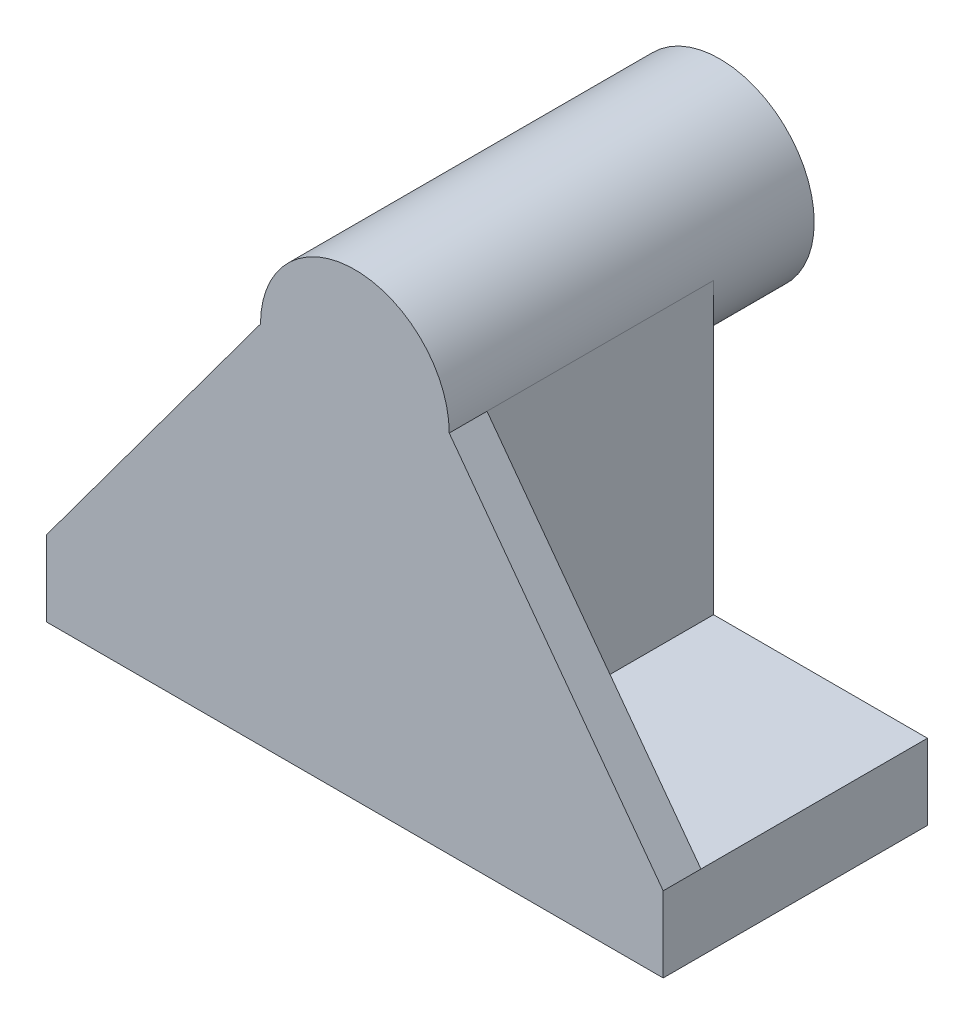
ISO-10303-21;
HEADER;
FILE_DESCRIPTION(('STEP AP214'),'2;1');
FILE_NAME('part.step','',(''),(''),'','','');
FILE_SCHEMA(('AUTOMOTIVE_DESIGN { 1 0 10303 214 1 1 1 1 }'));
ENDSEC;
DATA;
#1=APPLICATION_CONTEXT('core data for automotive mechanical design processes');
#2=APPLICATION_PROTOCOL_DEFINITION('international standard','automotive_design',2000,#1);
#3=PRODUCT_CONTEXT('',#1,'mechanical');
#4=PRODUCT('Part','Part','',(#3));
#5=PRODUCT_RELATED_PRODUCT_CATEGORY('part','',(#4));
#6=PRODUCT_DEFINITION_FORMATION('','',#4);
#7=PRODUCT_DEFINITION_CONTEXT('part definition',#1,'design');
#8=PRODUCT_DEFINITION('design','',#6,#7);
#9=PRODUCT_DEFINITION_SHAPE('','',#8);
#10=(LENGTH_UNIT() NAMED_UNIT(*) SI_UNIT(.MILLI.,.METRE.));
#11=(NAMED_UNIT(*) PLANE_ANGLE_UNIT() SI_UNIT($,.RADIAN.));
#12=(NAMED_UNIT(*) SI_UNIT($,.STERADIAN.) SOLID_ANGLE_UNIT());
#13=UNCERTAINTY_MEASURE_WITH_UNIT(LENGTH_MEASURE(1.E-05),#10,'distance_accuracy_value','');
#14=(GEOMETRIC_REPRESENTATION_CONTEXT(3) GLOBAL_UNCERTAINTY_ASSIGNED_CONTEXT((#13)) GLOBAL_UNIT_ASSIGNED_CONTEXT((#10,
#11,#12)) REPRESENTATION_CONTEXT('',''));
#15=CARTESIAN_POINT('',(0.,0.,0.));
#16=DIRECTION('',(0.,0.,1.));
#17=DIRECTION('',(1.,0.,0.));
#18=AXIS2_PLACEMENT_3D('',#15,#16,#17);
#19=CARTESIAN_POINT('',(-7.5,0.,-10.5));
#20=DIRECTION('',(-1.,0.,0.));
#21=DIRECTION('',(0.,-1.,0.));
#22=AXIS2_PLACEMENT_3D('',#19,#20,#21);
#23=PLANE('',#22);
#24=DIRECTION('',(0.,0.,1.));
#25=VECTOR('',#24,1.);
#26=CARTESIAN_POINT('',(-7.5,-23.,-10.5));
#27=LINE('',#26,#25);
#28=CARTESIAN_POINT('',(-7.5,-23.,-10.5));
#29=VERTEX_POINT('',#28);
#30=CARTESIAN_POINT('',(-7.5,-23.,7.49999999999999));
#31=VERTEX_POINT('',#30);
#32=EDGE_CURVE('E128',#29,#31,#27,.T.);
#33=ORIENTED_EDGE('',*,*,#32,.T.);
#34=DIRECTION('',(0.,1.,0.));
#35=VECTOR('',#34,1.);
#36=CARTESIAN_POINT('',(-7.5,0.,7.5));
#37=LINE('',#36,#35);
#38=CARTESIAN_POINT('',(-7.5,0.,7.49999999999999));
#39=VERTEX_POINT('',#38);
#40=EDGE_CURVE('E50',#31,#39,#37,.T.);
#41=ORIENTED_EDGE('',*,*,#40,.T.);
#42=DIRECTION('',(0.,0.,1.));
#43=VECTOR('',#42,1.);
#44=CARTESIAN_POINT('',(-7.5,0.,-10.5));
#45=LINE('',#44,#43);
#46=CARTESIAN_POINT('',(-7.5,0.,-10.5));
#47=VERTEX_POINT('',#46);
#48=EDGE_CURVE('E193',#47,#39,#45,.T.);
#49=ORIENTED_EDGE('',*,*,#48,.F.);
#50=DIRECTION('',(0.,-1.,0.));
#51=VECTOR('',#50,1.);
#52=CARTESIAN_POINT('',(-7.5,0.,-10.5));
#53=LINE('',#52,#51);
#54=EDGE_CURVE('E179',#47,#29,#53,.T.);
#55=ORIENTED_EDGE('',*,*,#54,.T.);
#56=EDGE_LOOP('',(#33,#41,#49,#55));
#57=FACE_BOUND('',#56,.T.);
#58=ADVANCED_FACE('F35',(#57),#23,.T.);
#59=CARTESIAN_POINT('',(-24.5,-23.,-10.5));
#60=DIRECTION('',(0.,-1.,0.));
#61=DIRECTION('',(0.,0.,-1.));
#62=AXIS2_PLACEMENT_3D('',#59,#60,#61);
#63=PLANE('',#62);
#64=DIRECTION('',(-1.,0.,0.));
#65=VECTOR('',#64,1.);
#66=CARTESIAN_POINT('',(-24.5,-23.,7.5));
#67=LINE('',#66,#65);
#68=CARTESIAN_POINT('',(-24.5,-23.,7.5));
#69=VERTEX_POINT('',#68);
#70=EDGE_CURVE('E11',#31,#69,#67,.T.);
#71=ORIENTED_EDGE('',*,*,#70,.F.);
#72=ORIENTED_EDGE('',*,*,#32,.F.);
#73=DIRECTION('',(1.,0.,0.));
#74=VECTOR('',#73,1.);
#75=CARTESIAN_POINT('',(-24.5,-23.,-10.5));
#76=LINE('',#75,#74);
#77=CARTESIAN_POINT('',(-24.5,-23.,-10.5));
#78=VERTEX_POINT('',#77);
#79=EDGE_CURVE('E114',#78,#29,#76,.T.);
#80=ORIENTED_EDGE('',*,*,#79,.F.);
#81=DIRECTION('',(0.,0.,1.));
#82=VECTOR('',#81,1.);
#83=CARTESIAN_POINT('',(-24.5,-23.,-10.5));
#84=LINE('',#83,#82);
#85=EDGE_CURVE('E111',#78,#69,#84,.T.);
#86=ORIENTED_EDGE('',*,*,#85,.T.);
#87=EDGE_LOOP('',(#71,#72,#80,#86));
#88=FACE_BOUND('',#87,.T.);
#89=ADVANCED_FACE('F113',(#88),#63,.F.);
#90=CARTESIAN_POINT('',(7.5,-23.,-10.5));
#91=DIRECTION('',(1.,0.,0.));
#92=DIRECTION('',(0.,0.,-1.));
#93=AXIS2_PLACEMENT_3D('',#90,#91,#92);
#94=PLANE('',#93);
#95=DIRECTION('',(0.,0.,1.));
#96=VECTOR('',#95,1.);
#97=CARTESIAN_POINT('',(7.5,0.,-10.5));
#98=LINE('',#97,#96);
#99=CARTESIAN_POINT('',(7.5,0.,-10.5));
#100=VERTEX_POINT('',#99);
#101=CARTESIAN_POINT('',(7.5,0.,7.5));
#102=VERTEX_POINT('',#101);
#103=EDGE_CURVE('E154',#100,#102,#98,.T.);
#104=ORIENTED_EDGE('',*,*,#103,.T.);
#105=DIRECTION('',(0.,-1.,0.));
#106=VECTOR('',#105,1.);
#107=CARTESIAN_POINT('',(7.5,-23.,7.5));
#108=LINE('',#107,#106);
#109=CARTESIAN_POINT('',(7.5,-23.,7.5));
#110=VERTEX_POINT('',#109);
#111=EDGE_CURVE('E168',#102,#110,#108,.T.);
#112=ORIENTED_EDGE('',*,*,#111,.T.);
#113=DIRECTION('',(0.,0.,1.));
#114=VECTOR('',#113,1.);
#115=CARTESIAN_POINT('',(7.5,-23.,-10.5));
#116=LINE('',#115,#114);
#117=CARTESIAN_POINT('',(7.5,-23.,-10.5));
#118=VERTEX_POINT('',#117);
#119=EDGE_CURVE('E196',#118,#110,#116,.T.);
#120=ORIENTED_EDGE('',*,*,#119,.F.);
#121=DIRECTION('',(0.,1.,0.));
#122=VECTOR('',#121,1.);
#123=CARTESIAN_POINT('',(7.5,-23.,-10.5));
#124=LINE('',#123,#122);
#125=EDGE_CURVE('E190',#118,#100,#124,.T.);
#126=ORIENTED_EDGE('',*,*,#125,.T.);
#127=EDGE_LOOP('',(#104,#112,#120,#126));
#128=FACE_BOUND('',#127,.T.);
#129=ADVANCED_FACE('F224',(#128),#94,.T.);
#130=CARTESIAN_POINT('',(24.5,-23.,-10.5));
#131=DIRECTION('',(0.,1.,0.));
#132=DIRECTION('',(0.,0.,1.));
#133=AXIS2_PLACEMENT_3D('',#130,#131,#132);
#134=PLANE('',#133);
#135=ORIENTED_EDGE('',*,*,#119,.T.);
#136=DIRECTION('',(1.,0.,0.));
#137=VECTOR('',#136,1.);
#138=CARTESIAN_POINT('',(24.5,-23.,7.5));
#139=LINE('',#138,#137);
#140=CARTESIAN_POINT('',(24.5,-23.,7.5));
#141=VERTEX_POINT('',#140);
#142=EDGE_CURVE('E165',#110,#141,#139,.T.);
#143=ORIENTED_EDGE('',*,*,#142,.T.);
#144=DIRECTION('',(0.,0.,1.));
#145=VECTOR('',#144,1.);
#146=CARTESIAN_POINT('',(24.5,-23.,-10.5));
#147=LINE('',#146,#145);
#148=CARTESIAN_POINT('',(24.5,-23.,-10.5));
#149=VERTEX_POINT('',#148);
#150=EDGE_CURVE('E199',#149,#141,#147,.T.);
#151=ORIENTED_EDGE('',*,*,#150,.F.);
#152=DIRECTION('',(-1.,0.,0.));
#153=VECTOR('',#152,1.);
#154=CARTESIAN_POINT('',(24.5,-23.,-10.5));
#155=LINE('',#154,#153);
#156=EDGE_CURVE('E187',#149,#118,#155,.T.);
#157=ORIENTED_EDGE('',*,*,#156,.T.);
#158=EDGE_LOOP('',(#135,#143,#151,#157));
#159=FACE_BOUND('',#158,.T.);
#160=ADVANCED_FACE('F232',(#159),#134,.T.);
#161=CARTESIAN_POINT('',(0.,0.,-10.5));
#162=DIRECTION('',(0.,0.,1.));
#163=DIRECTION('',(1.,0.,0.));
#164=AXIS2_PLACEMENT_3D('',#161,#162,#163);
#165=CYLINDRICAL_SURFACE('',#164,7.5);
#166=DIRECTION('',(0.,0.,1.));
#167=VECTOR('',#166,1.);
#168=CARTESIAN_POINT('',(-7.5,0.,-10.5));
#169=LINE('',#168,#167);
#170=CARTESIAN_POINT('',(-7.5,0.,10.5));
#171=VERTEX_POINT('',#170);
#172=EDGE_CURVE('E136',#171,#39,#169,.F.);
#173=ORIENTED_EDGE('',*,*,#172,.F.);
#174=CARTESIAN_POINT('',(0.,0.,10.5));
#175=DIRECTION('',(0.,0.,1.));
#176=DIRECTION('',(1.,0.,0.));
#177=AXIS2_PLACEMENT_3D('',#174,#175,#176);
#178=CIRCLE('',#177,7.5);
#179=CARTESIAN_POINT('',(7.5,0.,10.5));
#180=VERTEX_POINT('',#179);
#181=EDGE_CURVE('E171',#180,#171,#178,.T.);
#182=ORIENTED_EDGE('',*,*,#181,.F.);
#183=DIRECTION('',(0.,0.,-1.));
#184=VECTOR('',#183,1.);
#185=CARTESIAN_POINT('',(7.5,0.,-10.5));
#186=LINE('',#185,#184);
#187=EDGE_CURVE('E162',#102,#180,#186,.F.);
#188=ORIENTED_EDGE('',*,*,#187,.F.);
#189=ORIENTED_EDGE('',*,*,#103,.F.);
#190=CARTESIAN_POINT('',(0.,0.,-10.5));
#191=DIRECTION('',(0.,0.,1.));
#192=DIRECTION('',(1.,0.,0.));
#193=AXIS2_PLACEMENT_3D('',#190,#191,#192);
#194=CIRCLE('',#193,7.5);
#195=EDGE_CURVE('E43',#47,#100,#194,.T.);
#196=ORIENTED_EDGE('',*,*,#195,.F.);
#197=ORIENTED_EDGE('',*,*,#48,.T.);
#198=EDGE_LOOP('',(#173,#182,#188,#189,#196,#197));
#199=FACE_BOUND('',#198,.T.);
#200=CARTESIAN_POINT('',(0.,0.,-18.5));
#201=DIRECTION('',(0.,0.,1.));
#202=DIRECTION('',(1.,0.,0.));
#203=AXIS2_PLACEMENT_3D('',#200,#201,#202);
#204=CIRCLE('',#203,7.5);
#205=CARTESIAN_POINT('',(7.5,0.,-18.5));
#206=VERTEX_POINT('',#205);
#207=EDGE_CURVE('E147',#206,#206,#204,.T.);
#208=ORIENTED_EDGE('',*,*,#207,.T.);
#209=EDGE_LOOP('',(#208));
#210=FACE_BOUND('',#209,.T.);
#211=ADVANCED_FACE('F37',(#199,#210),#165,.T.);
#212=CARTESIAN_POINT('',(24.5,-29.,-10.5));
#213=DIRECTION('',(1.,0.,0.));
#214=DIRECTION('',(0.,0.,-1.));
#215=AXIS2_PLACEMENT_3D('',#212,#213,#214);
#216=PLANE('',#215);
#217=DIRECTION('',(0.,1.,0.));
#218=VECTOR('',#217,1.);
#219=CARTESIAN_POINT('',(24.5,-29.,10.5));
#220=LINE('',#219,#218);
#221=CARTESIAN_POINT('',(24.5,-29.,10.5));
#222=VERTEX_POINT('',#221);
#223=CARTESIAN_POINT('',(24.5,-23.,10.5));
#224=VERTEX_POINT('',#223);
#225=EDGE_CURVE('E176',#222,#224,#220,.T.);
#226=ORIENTED_EDGE('',*,*,#225,.F.);
#227=DIRECTION('',(0.,0.,1.));
#228=VECTOR('',#227,1.);
#229=CARTESIAN_POINT('',(24.5,-29.,-10.5));
#230=LINE('',#229,#228);
#231=CARTESIAN_POINT('',(24.5,-29.,-10.5));
#232=VERTEX_POINT('',#231);
#233=EDGE_CURVE('E202',#232,#222,#230,.T.);
#234=ORIENTED_EDGE('',*,*,#233,.F.);
#235=DIRECTION('',(0.,1.,0.));
#236=VECTOR('',#235,1.);
#237=CARTESIAN_POINT('',(24.5,-29.,-10.5));
#238=LINE('',#237,#236);
#239=EDGE_CURVE('E184',#232,#149,#238,.T.);
#240=ORIENTED_EDGE('',*,*,#239,.T.);
#241=ORIENTED_EDGE('',*,*,#150,.T.);
#242=DIRECTION('',(0.,0.,-1.));
#243=VECTOR('',#242,1.);
#244=CARTESIAN_POINT('',(24.5,-23.,-10.5));
#245=LINE('',#244,#243);
#246=EDGE_CURVE('E157',#141,#224,#245,.F.);
#247=ORIENTED_EDGE('',*,*,#246,.T.);
#248=EDGE_LOOP('',(#226,#234,#240,#241,#247));
#249=FACE_BOUND('',#248,.T.);
#250=ADVANCED_FACE('F228',(#249),#216,.T.);
#251=CARTESIAN_POINT('',(-7.5,-29.,-10.5));
#252=DIRECTION('',(0.,-1.,0.));
#253=DIRECTION('',(0.,0.,-1.));
#254=AXIS2_PLACEMENT_3D('',#251,#252,#253);
#255=PLANE('',#254);
#256=DIRECTION('',(1.,0.,0.));
#257=VECTOR('',#256,1.);
#258=CARTESIAN_POINT('',(-7.5,-29.,10.5));
#259=LINE('',#258,#257);
#260=CARTESIAN_POINT('',(-24.5,-29.,10.5));
#261=VERTEX_POINT('',#260);
#262=EDGE_CURVE('E173',#261,#222,#259,.T.);
#263=ORIENTED_EDGE('',*,*,#262,.F.);
#264=DIRECTION('',(0.,0.,1.));
#265=VECTOR('',#264,1.);
#266=CARTESIAN_POINT('',(-24.5,-29.,-10.5));
#267=LINE('',#266,#265);
#268=CARTESIAN_POINT('',(-24.5,-29.,-10.5));
#269=VERTEX_POINT('',#268);
#270=EDGE_CURVE('E117',#269,#261,#267,.T.);
#271=ORIENTED_EDGE('',*,*,#270,.F.);
#272=DIRECTION('',(1.,0.,0.));
#273=VECTOR('',#272,1.);
#274=CARTESIAN_POINT('',(-7.5,-29.,-10.5));
#275=LINE('',#274,#273);
#276=EDGE_CURVE('E182',#269,#232,#275,.T.);
#277=ORIENTED_EDGE('',*,*,#276,.T.);
#278=ORIENTED_EDGE('',*,*,#233,.T.);
#279=EDGE_LOOP('',(#263,#271,#277,#278));
#280=FACE_BOUND('',#279,.T.);
#281=ADVANCED_FACE('F215',(#280),#255,.T.);
#282=CARTESIAN_POINT('',(0.,0.,-10.5));
#283=DIRECTION('',(0.,0.,1.));
#284=DIRECTION('',(1.,0.,0.));
#285=AXIS2_PLACEMENT_3D('',#282,#283,#284);
#286=PLANE('',#285);
#287=ORIENTED_EDGE('',*,*,#125,.F.);
#288=ORIENTED_EDGE('',*,*,#156,.F.);
#289=ORIENTED_EDGE('',*,*,#239,.F.);
#290=ORIENTED_EDGE('',*,*,#276,.F.);
#291=DIRECTION('',(0.,1.,0.));
#292=VECTOR('',#291,1.);
#293=CARTESIAN_POINT('',(-24.5,-29.,-10.5));
#294=LINE('',#293,#292);
#295=EDGE_CURVE('E145',#269,#78,#294,.T.);
#296=ORIENTED_EDGE('',*,*,#295,.T.);
#297=ORIENTED_EDGE('',*,*,#79,.T.);
#298=ORIENTED_EDGE('',*,*,#54,.F.);
#299=ORIENTED_EDGE('',*,*,#195,.T.);
#300=EDGE_LOOP('',(#287,#288,#289,#290,#296,#297,#298,#299));
#301=FACE_BOUND('',#300,.T.);
#302=ADVANCED_FACE('F210',(#301),#286,.F.);
#303=CARTESIAN_POINT('',(0.,0.,10.5));
#304=DIRECTION('',(0.,0.,1.));
#305=DIRECTION('',(1.,0.,0.));
#306=AXIS2_PLACEMENT_3D('',#303,#304,#305);
#307=PLANE('',#306);
#308=ORIENTED_EDGE('',*,*,#181,.T.);
#309=DIRECTION('',(-0.594391061083806,-0.804176141466325,0.));
#310=VECTOR('',#309,1.);
#311=CARTESIAN_POINT('',(-7.5,0.,10.5));
#312=LINE('',#311,#310);
#313=CARTESIAN_POINT('',(-24.5,-23.,10.5));
#314=VERTEX_POINT('',#313);
#315=EDGE_CURVE('E137',#171,#314,#312,.T.);
#316=ORIENTED_EDGE('',*,*,#315,.T.);
#317=DIRECTION('',(0.,1.,0.));
#318=VECTOR('',#317,1.);
#319=CARTESIAN_POINT('',(-24.5,-29.,10.5));
#320=LINE('',#319,#318);
#321=EDGE_CURVE('E123',#261,#314,#320,.T.);
#322=ORIENTED_EDGE('',*,*,#321,.F.);
#323=ORIENTED_EDGE('',*,*,#262,.T.);
#324=ORIENTED_EDGE('',*,*,#225,.T.);
#325=DIRECTION('',(0.594391061083806,-0.804176141466325,0.));
#326=VECTOR('',#325,1.);
#327=CARTESIAN_POINT('',(7.5,0.,10.5));
#328=LINE('',#327,#326);
#329=EDGE_CURVE('E155',#180,#224,#328,.T.);
#330=ORIENTED_EDGE('',*,*,#329,.F.);
#331=EDGE_LOOP('',(#308,#316,#322,#323,#324,#330));
#332=FACE_BOUND('',#331,.T.);
#333=ADVANCED_FACE('F219',(#332),#307,.T.);
#334=CARTESIAN_POINT('',(7.5,0.,10.5));
#335=DIRECTION('',(-0.804176141466325,-0.594391061083806,0.));
#336=DIRECTION('',(0.594391061083806,-0.804176141466325,0.));
#337=AXIS2_PLACEMENT_3D('',#334,#335,#336);
#338=PLANE('',#337);
#339=DIRECTION('',(0.594391061083806,-0.804176141466325,0.));
#340=VECTOR('',#339,1.);
#341=CARTESIAN_POINT('',(7.5,0.,7.5));
#342=LINE('',#341,#340);
#343=EDGE_CURVE('E152',#102,#141,#342,.T.);
#344=ORIENTED_EDGE('',*,*,#343,.F.);
#345=ORIENTED_EDGE('',*,*,#187,.T.);
#346=ORIENTED_EDGE('',*,*,#329,.T.);
#347=ORIENTED_EDGE('',*,*,#246,.F.);
#348=EDGE_LOOP('',(#344,#345,#346,#347));
#349=FACE_BOUND('',#348,.T.);
#350=ADVANCED_FACE('F229',(#349),#338,.F.);
#351=CARTESIAN_POINT('',(8.5,-10.75,7.5));
#352=DIRECTION('',(0.,0.,1.));
#353=DIRECTION('',(1.,0.,0.));
#354=AXIS2_PLACEMENT_3D('',#351,#352,#353);
#355=PLANE('',#354);
#356=ORIENTED_EDGE('',*,*,#111,.F.);
#357=ORIENTED_EDGE('',*,*,#343,.T.);
#358=ORIENTED_EDGE('',*,*,#142,.F.);
#359=EDGE_LOOP('',(#356,#357,#358));
#360=FACE_BOUND('',#359,.T.);
#361=ADVANCED_FACE('F231',(#360),#355,.F.);
#362=CARTESIAN_POINT('',(0.,0.,-18.5));
#363=DIRECTION('',(0.,0.,1.));
#364=DIRECTION('',(1.,0.,0.));
#365=AXIS2_PLACEMENT_3D('',#362,#363,#364);
#366=PLANE('',#365);
#367=ORIENTED_EDGE('',*,*,#207,.F.);
#368=EDGE_LOOP('',(#367));
#369=FACE_BOUND('',#368,.T.);
#370=ADVANCED_FACE('F282',(#369),#366,.F.);
#371=CARTESIAN_POINT('',(-24.5,-29.,-10.5));
#372=DIRECTION('',(1.,0.,0.));
#373=DIRECTION('',(0.,0.,-1.));
#374=AXIS2_PLACEMENT_3D('',#371,#372,#373);
#375=PLANE('',#374);
#376=EDGE_CURVE('E118',#69,#314,#84,.T.);
#377=ORIENTED_EDGE('',*,*,#376,.F.);
#378=ORIENTED_EDGE('',*,*,#85,.F.);
#379=ORIENTED_EDGE('',*,*,#295,.F.);
#380=ORIENTED_EDGE('',*,*,#270,.T.);
#381=ORIENTED_EDGE('',*,*,#321,.T.);
#382=EDGE_LOOP('',(#377,#378,#379,#380,#381));
#383=FACE_BOUND('',#382,.T.);
#384=ADVANCED_FACE('F121',(#383),#375,.F.);
#385=CARTESIAN_POINT('',(-7.5,0.,10.5));
#386=DIRECTION('',(-0.804176141466325,0.594391061083806,0.));
#387=DIRECTION('',(-0.594391061083806,-0.804176141466325,0.));
#388=AXIS2_PLACEMENT_3D('',#385,#386,#387);
#389=PLANE('',#388);
#390=ORIENTED_EDGE('',*,*,#315,.F.);
#391=ORIENTED_EDGE('',*,*,#172,.T.);
#392=DIRECTION('',(-0.594391061083806,-0.804176141466325,0.));
#393=VECTOR('',#392,1.);
#394=CARTESIAN_POINT('',(-7.5,0.,7.5));
#395=LINE('',#394,#393);
#396=EDGE_CURVE('E132',#39,#69,#395,.T.);
#397=ORIENTED_EDGE('',*,*,#396,.T.);
#398=ORIENTED_EDGE('',*,*,#376,.T.);
#399=EDGE_LOOP('',(#390,#391,#397,#398));
#400=FACE_BOUND('',#399,.T.);
#401=ADVANCED_FACE('F134',(#400),#389,.T.);
#402=CARTESIAN_POINT('',(0.,-10.75,7.5));
#403=DIRECTION('',(0.,0.,1.));
#404=DIRECTION('',(1.,0.,0.));
#405=AXIS2_PLACEMENT_3D('',#402,#403,#404);
#406=PLANE('',#405);
#407=ORIENTED_EDGE('',*,*,#40,.F.);
#408=ORIENTED_EDGE('',*,*,#70,.T.);
#409=ORIENTED_EDGE('',*,*,#396,.F.);
#410=EDGE_LOOP('',(#407,#408,#409));
#411=FACE_BOUND('',#410,.T.);
#412=ADVANCED_FACE('F131',(#411),#406,.F.);
#413=CLOSED_SHELL('',(#58,#89,#129,#160,#211,#250,#281,#302,#333,#350,#361,#370,#384,#401,#412));
#414=MANIFOLD_SOLID_BREP('B2',#413);
#415=ADVANCED_BREP_SHAPE_REPRESENTATION('',(#18,#414),#14);
#416=SHAPE_DEFINITION_REPRESENTATION(#9,#415);
ENDSEC;
END-ISO-10303-21;
